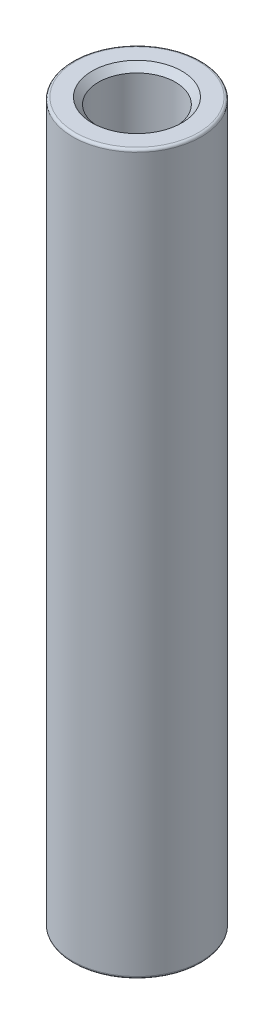
ISO-10303-21;
HEADER;
FILE_DESCRIPTION(('STEP AP214'),'2;1');
FILE_NAME('part.step','',(''),(''),'','','');
FILE_SCHEMA(('AUTOMOTIVE_DESIGN { 1 0 10303 214 1 1 1 1 }'));
ENDSEC;
DATA;
#1=APPLICATION_CONTEXT('core data for automotive mechanical design processes');
#2=APPLICATION_PROTOCOL_DEFINITION('international standard','automotive_design',2000,#1);
#3=PRODUCT_CONTEXT('',#1,'mechanical');
#4=PRODUCT('Part','Part','',(#3));
#5=PRODUCT_RELATED_PRODUCT_CATEGORY('part','',(#4));
#6=PRODUCT_DEFINITION_FORMATION('','',#4);
#7=PRODUCT_DEFINITION_CONTEXT('part definition',#1,'design');
#8=PRODUCT_DEFINITION('design','',#6,#7);
#9=PRODUCT_DEFINITION_SHAPE('','',#8);
#10=(LENGTH_UNIT() NAMED_UNIT(*) SI_UNIT(.MILLI.,.METRE.));
#11=(NAMED_UNIT(*) PLANE_ANGLE_UNIT() SI_UNIT($,.RADIAN.));
#12=(NAMED_UNIT(*) SI_UNIT($,.STERADIAN.) SOLID_ANGLE_UNIT());
#13=UNCERTAINTY_MEASURE_WITH_UNIT(LENGTH_MEASURE(1.E-05),#10,'distance_accuracy_value','');
#14=(GEOMETRIC_REPRESENTATION_CONTEXT(3) GLOBAL_UNCERTAINTY_ASSIGNED_CONTEXT((#13)) GLOBAL_UNIT_ASSIGNED_CONTEXT((#10,
#11,#12)) REPRESENTATION_CONTEXT('',''));
#15=CARTESIAN_POINT('',(0.,0.,0.));
#16=DIRECTION('',(0.,0.,1.));
#17=DIRECTION('',(1.,0.,0.));
#18=AXIS2_PLACEMENT_3D('',#15,#16,#17);
#19=CARTESIAN_POINT('',(0.,14.,0.));
#20=DIRECTION('',(0.,1.,0.));
#21=DIRECTION('',(0.,0.,1.));
#22=AXIS2_PLACEMENT_3D('',#19,#20,#21);
#23=PLANE('',#22);
#24=CARTESIAN_POINT('',(0.,14.,0.));
#25=DIRECTION('',(0.,1.,0.));
#26=DIRECTION('',(0.,0.,1.));
#27=AXIS2_PLACEMENT_3D('',#24,#25,#26);
#28=CIRCLE('',#27,2.4);
#29=CARTESIAN_POINT('',(0.,14.,2.4));
#30=VERTEX_POINT('',#29);
#31=EDGE_CURVE('E10',#30,#30,#28,.T.);
#32=ORIENTED_EDGE('',*,*,#31,.T.);
#33=EDGE_LOOP('',(#32));
#34=FACE_BOUND('',#33,.T.);
#35=CARTESIAN_POINT('',(0.,14.,0.));
#36=DIRECTION('',(0.,1.,0.));
#37=DIRECTION('',(0.,0.,1.));
#38=AXIS2_PLACEMENT_3D('',#35,#36,#37);
#39=CIRCLE('',#38,1.75000000000001);
#40=CARTESIAN_POINT('',(0.,14.,1.75000000000001));
#41=VERTEX_POINT('',#40);
#42=EDGE_CURVE('E53',#41,#41,#39,.F.);
#43=ORIENTED_EDGE('',*,*,#42,.T.);
#44=EDGE_LOOP('',(#43));
#45=FACE_BOUND('',#44,.T.);
#46=ADVANCED_FACE('F33',(#34,#45),#23,.T.);
#47=CARTESIAN_POINT('',(0.,-14.,0.));
#48=DIRECTION('',(0.,1.,0.));
#49=DIRECTION('',(0.,0.,1.));
#50=AXIS2_PLACEMENT_3D('',#47,#48,#49);
#51=PLANE('',#50);
#52=CARTESIAN_POINT('',(0.,-14.,0.));
#53=DIRECTION('',(0.,1.,0.));
#54=DIRECTION('',(0.,0.,1.));
#55=AXIS2_PLACEMENT_3D('',#52,#53,#54);
#56=CIRCLE('',#55,2.4);
#57=CARTESIAN_POINT('',(0.,-14.,2.4));
#58=VERTEX_POINT('',#57);
#59=EDGE_CURVE('E40',#58,#58,#56,.F.);
#60=ORIENTED_EDGE('',*,*,#59,.T.);
#61=EDGE_LOOP('',(#60));
#62=FACE_BOUND('',#61,.T.);
#63=CARTESIAN_POINT('',(0.,-14.,0.));
#64=DIRECTION('',(0.,1.,0.));
#65=DIRECTION('',(0.,0.,1.));
#66=AXIS2_PLACEMENT_3D('',#63,#64,#65);
#67=CIRCLE('',#66,1.75000000000001);
#68=CARTESIAN_POINT('',(0.,-14.,1.75000000000001));
#69=VERTEX_POINT('',#68);
#70=EDGE_CURVE('E62',#69,#69,#67,.T.);
#71=ORIENTED_EDGE('',*,*,#70,.T.);
#72=EDGE_LOOP('',(#71));
#73=FACE_BOUND('',#72,.T.);
#74=ADVANCED_FACE('F66',(#62,#73),#51,.F.);
#75=CARTESIAN_POINT('',(0.,14.,0.));
#76=DIRECTION('',(0.,-1.,0.));
#77=DIRECTION('',(0.,0.,-1.));
#78=AXIS2_PLACEMENT_3D('',#75,#76,#77);
#79=CYLINDRICAL_SURFACE('',#78,2.5);
#80=CARTESIAN_POINT('',(0.,-13.9,0.));
#81=DIRECTION('',(0.,1.,0.));
#82=DIRECTION('',(0.,0.,1.));
#83=AXIS2_PLACEMENT_3D('',#80,#81,#82);
#84=CIRCLE('',#83,2.5);
#85=CARTESIAN_POINT('',(0.,-13.9,2.5));
#86=VERTEX_POINT('',#85);
#87=EDGE_CURVE('E44',#86,#86,#84,.T.);
#88=ORIENTED_EDGE('',*,*,#87,.T.);
#89=EDGE_LOOP('',(#88));
#90=FACE_BOUND('',#89,.T.);
#91=CARTESIAN_POINT('',(0.,13.9,0.));
#92=DIRECTION('',(0.,1.,0.));
#93=DIRECTION('',(0.,0.,1.));
#94=AXIS2_PLACEMENT_3D('',#91,#92,#93);
#95=CIRCLE('',#94,2.5);
#96=CARTESIAN_POINT('',(0.,13.9,2.5));
#97=VERTEX_POINT('',#96);
#98=EDGE_CURVE('E48',#97,#97,#95,.F.);
#99=ORIENTED_EDGE('',*,*,#98,.T.);
#100=EDGE_LOOP('',(#99));
#101=FACE_BOUND('',#100,.T.);
#102=ADVANCED_FACE('F81',(#90,#101),#79,.T.);
#103=CARTESIAN_POINT('',(0.,14.,0.));
#104=DIRECTION('',(0.,-1.,0.));
#105=DIRECTION('',(0.,0.,-1.));
#106=AXIS2_PLACEMENT_3D('',#103,#104,#105);
#107=CYLINDRICAL_SURFACE('',#106,1.5);
#108=CARTESIAN_POINT('',(0.,-13.75,0.));
#109=DIRECTION('',(0.,1.,0.));
#110=DIRECTION('',(0.,0.,1.));
#111=AXIS2_PLACEMENT_3D('',#108,#109,#110);
#112=CIRCLE('',#111,1.5);
#113=CARTESIAN_POINT('',(0.,-13.75,1.5));
#114=VERTEX_POINT('',#113);
#115=EDGE_CURVE('E56',#114,#114,#112,.F.);
#116=ORIENTED_EDGE('',*,*,#115,.T.);
#117=EDGE_LOOP('',(#116));
#118=FACE_BOUND('',#117,.T.);
#119=CARTESIAN_POINT('',(0.,13.75,0.));
#120=DIRECTION('',(0.,1.,0.));
#121=DIRECTION('',(0.,0.,1.));
#122=AXIS2_PLACEMENT_3D('',#119,#120,#121);
#123=CIRCLE('',#122,1.5);
#124=CARTESIAN_POINT('',(0.,13.75,1.5));
#125=VERTEX_POINT('',#124);
#126=EDGE_CURVE('E59',#125,#125,#123,.T.);
#127=ORIENTED_EDGE('',*,*,#126,.T.);
#128=EDGE_LOOP('',(#127));
#129=FACE_BOUND('',#128,.T.);
#130=ADVANCED_FACE('F71',(#118,#129),#107,.F.);
#131=CARTESIAN_POINT('',(0.,-14.,0.));
#132=DIRECTION('',(0.,-1.,0.));
#133=DIRECTION('',(0.,0.,-1.));
#134=AXIS2_PLACEMENT_3D('',#131,#132,#133);
#135=CONICAL_SURFACE('',#134,1.75000000000001,0.785398163397451);
#136=ORIENTED_EDGE('',*,*,#115,.F.);
#137=EDGE_LOOP('',(#136));
#138=FACE_BOUND('',#137,.T.);
#139=ORIENTED_EDGE('',*,*,#70,.F.);
#140=EDGE_LOOP('',(#139));
#141=FACE_BOUND('',#140,.T.);
#142=ADVANCED_FACE('F68',(#138,#141),#135,.F.);
#143=CARTESIAN_POINT('',(0.,13.75,0.));
#144=DIRECTION('',(0.,1.,0.));
#145=DIRECTION('',(0.,0.,1.));
#146=AXIS2_PLACEMENT_3D('',#143,#144,#145);
#147=CONICAL_SURFACE('',#146,1.5,0.785398163397451);
#148=ORIENTED_EDGE('',*,*,#42,.F.);
#149=EDGE_LOOP('',(#148));
#150=FACE_BOUND('',#149,.T.);
#151=ORIENTED_EDGE('',*,*,#126,.F.);
#152=EDGE_LOOP('',(#151));
#153=FACE_BOUND('',#152,.T.);
#154=ADVANCED_FACE('F70',(#150,#153),#147,.F.);
#155=CARTESIAN_POINT('',(0.,-13.9,0.));
#156=DIRECTION('',(0.,1.,0.));
#157=DIRECTION('',(0.,0.,1.));
#158=AXIS2_PLACEMENT_3D('',#155,#156,#157);
#159=TOROIDAL_SURFACE('',#158,2.4,0.1);
#160=ORIENTED_EDGE('',*,*,#59,.F.);
#161=EDGE_LOOP('',(#160));
#162=FACE_BOUND('',#161,.T.);
#163=ORIENTED_EDGE('',*,*,#87,.F.);
#164=EDGE_LOOP('',(#163));
#165=FACE_BOUND('',#164,.T.);
#166=ADVANCED_FACE('F78',(#162,#165),#159,.T.);
#167=CARTESIAN_POINT('',(0.,13.9,0.));
#168=DIRECTION('',(0.,1.,0.));
#169=DIRECTION('',(0.,0.,1.));
#170=AXIS2_PLACEMENT_3D('',#167,#168,#169);
#171=TOROIDAL_SURFACE('',#170,2.4,0.1);
#172=ORIENTED_EDGE('',*,*,#98,.F.);
#173=EDGE_LOOP('',(#172));
#174=FACE_BOUND('',#173,.T.);
#175=ORIENTED_EDGE('',*,*,#31,.F.);
#176=EDGE_LOOP('',(#175));
#177=FACE_BOUND('',#176,.T.);
#178=ADVANCED_FACE('F35',(#174,#177),#171,.T.);
#179=CLOSED_SHELL('',(#46,#74,#102,#130,#142,#154,#166,#178));
#180=MANIFOLD_SOLID_BREP('B2',#179);
#181=ADVANCED_BREP_SHAPE_REPRESENTATION('',(#18,#180),#14);
#182=SHAPE_DEFINITION_REPRESENTATION(#9,#181);
ENDSEC;
END-ISO-10303-21;
